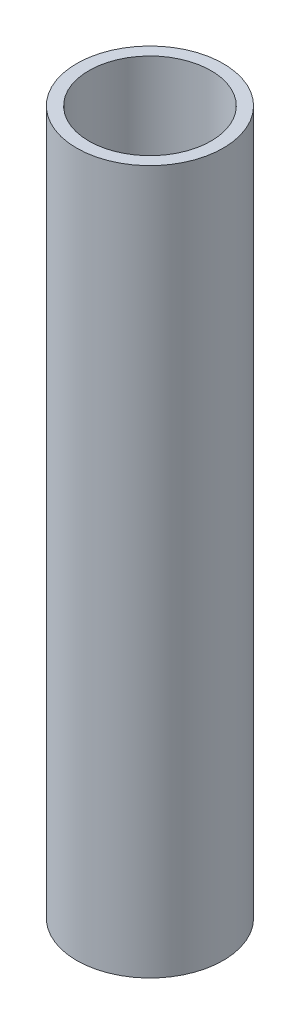
ISO-10303-21;
HEADER;
FILE_DESCRIPTION(('STEP AP214'),'2;1');
FILE_NAME('part.step','',(''),(''),'','','');
FILE_SCHEMA(('AUTOMOTIVE_DESIGN { 1 0 10303 214 1 1 1 1 }'));
ENDSEC;
DATA;
#1=APPLICATION_CONTEXT('core data for automotive mechanical design processes');
#2=APPLICATION_PROTOCOL_DEFINITION('international standard','automotive_design',2000,#1);
#3=PRODUCT_CONTEXT('',#1,'mechanical');
#4=PRODUCT('Part','Part','',(#3));
#5=PRODUCT_RELATED_PRODUCT_CATEGORY('part','',(#4));
#6=PRODUCT_DEFINITION_FORMATION('','',#4);
#7=PRODUCT_DEFINITION_CONTEXT('part definition',#1,'design');
#8=PRODUCT_DEFINITION('design','',#6,#7);
#9=PRODUCT_DEFINITION_SHAPE('','',#8);
#10=(LENGTH_UNIT() NAMED_UNIT(*) SI_UNIT(.MILLI.,.METRE.));
#11=(NAMED_UNIT(*) PLANE_ANGLE_UNIT() SI_UNIT($,.RADIAN.));
#12=(NAMED_UNIT(*) SI_UNIT($,.STERADIAN.) SOLID_ANGLE_UNIT());
#13=UNCERTAINTY_MEASURE_WITH_UNIT(LENGTH_MEASURE(1.E-05),#10,'distance_accuracy_value','');
#14=(GEOMETRIC_REPRESENTATION_CONTEXT(3) GLOBAL_UNCERTAINTY_ASSIGNED_CONTEXT((#13)) GLOBAL_UNIT_ASSIGNED_CONTEXT((#10,
#11,#12)) REPRESENTATION_CONTEXT('',''));
#15=CARTESIAN_POINT('',(0.,0.,0.));
#16=DIRECTION('',(0.,0.,1.));
#17=DIRECTION('',(1.,0.,0.));
#18=AXIS2_PLACEMENT_3D('',#15,#16,#17);
#19=CARTESIAN_POINT('',(0.,365.76,0.));
#20=DIRECTION('',(0.,-1.,0.));
#21=DIRECTION('',(0.,0.,-1.));
#22=AXIS2_PLACEMENT_3D('',#19,#20,#21);
#23=CYLINDRICAL_SURFACE('',#22,38.1);
#24=CARTESIAN_POINT('',(0.,365.76,0.));
#25=DIRECTION('',(0.,1.,0.));
#26=DIRECTION('',(0.,0.,1.));
#27=AXIS2_PLACEMENT_3D('',#24,#25,#26);
#28=CIRCLE('',#27,38.1);
#29=CARTESIAN_POINT('',(0.,365.76,38.1));
#30=VERTEX_POINT('',#29);
#31=EDGE_CURVE('E10',#30,#30,#28,.T.);
#32=ORIENTED_EDGE('',*,*,#31,.F.);
#33=EDGE_LOOP('',(#32));
#34=FACE_BOUND('',#33,.T.);
#35=CARTESIAN_POINT('',(0.,0.,0.));
#36=DIRECTION('',(0.,1.,0.));
#37=DIRECTION('',(0.,0.,1.));
#38=AXIS2_PLACEMENT_3D('',#35,#36,#37);
#39=CIRCLE('',#38,38.1);
#40=CARTESIAN_POINT('',(0.,0.,38.1));
#41=VERTEX_POINT('',#40);
#42=EDGE_CURVE('E36',#41,#41,#39,.T.);
#43=ORIENTED_EDGE('',*,*,#42,.T.);
#44=EDGE_LOOP('',(#43));
#45=FACE_BOUND('',#44,.T.);
#46=ADVANCED_FACE('F33',(#34,#45),#23,.T.);
#47=CARTESIAN_POINT('',(0.,365.76,0.));
#48=DIRECTION('',(0.,1.,0.));
#49=DIRECTION('',(0.,0.,1.));
#50=AXIS2_PLACEMENT_3D('',#47,#48,#49);
#51=PLANE('',#50);
#52=CARTESIAN_POINT('',(0.,365.76,0.));
#53=DIRECTION('',(0.,1.,0.));
#54=DIRECTION('',(0.,0.,1.));
#55=AXIS2_PLACEMENT_3D('',#52,#53,#54);
#56=CIRCLE('',#55,31.75);
#57=CARTESIAN_POINT('',(0.,365.76,31.75));
#58=VERTEX_POINT('',#57);
#59=EDGE_CURVE('E45',#58,#58,#56,.T.);
#60=ORIENTED_EDGE('',*,*,#59,.F.);
#61=EDGE_LOOP('',(#60));
#62=FACE_BOUND('',#61,.T.);
#63=ORIENTED_EDGE('',*,*,#31,.T.);
#64=EDGE_LOOP('',(#63));
#65=FACE_BOUND('',#64,.T.);
#66=ADVANCED_FACE('F60',(#62,#65),#51,.T.);
#67=CARTESIAN_POINT('',(0.,0.,0.));
#68=DIRECTION('',(0.,1.,0.));
#69=DIRECTION('',(0.,0.,1.));
#70=AXIS2_PLACEMENT_3D('',#67,#68,#69);
#71=PLANE('',#70);
#72=CARTESIAN_POINT('',(0.,0.,0.));
#73=DIRECTION('',(0.,1.,0.));
#74=DIRECTION('',(0.,0.,1.));
#75=AXIS2_PLACEMENT_3D('',#72,#73,#74);
#76=CIRCLE('',#75,31.75);
#77=CARTESIAN_POINT('',(0.,0.,31.75));
#78=VERTEX_POINT('',#77);
#79=EDGE_CURVE('E43',#78,#78,#76,.T.);
#80=ORIENTED_EDGE('',*,*,#79,.T.);
#81=EDGE_LOOP('',(#80));
#82=FACE_BOUND('',#81,.T.);
#83=ORIENTED_EDGE('',*,*,#42,.F.);
#84=EDGE_LOOP('',(#83));
#85=FACE_BOUND('',#84,.T.);
#86=ADVANCED_FACE('F51',(#82,#85),#71,.F.);
#87=CARTESIAN_POINT('',(0.,0.,0.));
#88=DIRECTION('',(0.,1.,0.));
#89=DIRECTION('',(0.,0.,1.));
#90=AXIS2_PLACEMENT_3D('',#87,#88,#89);
#91=CYLINDRICAL_SURFACE('',#90,31.75);
#92=ORIENTED_EDGE('',*,*,#79,.F.);
#93=EDGE_LOOP('',(#92));
#94=FACE_BOUND('',#93,.T.);
#95=ORIENTED_EDGE('',*,*,#59,.T.);
#96=EDGE_LOOP('',(#95));
#97=FACE_BOUND('',#96,.T.);
#98=ADVANCED_FACE('F54',(#94,#97),#91,.F.);
#99=CLOSED_SHELL('',(#46,#66,#86,#98));
#100=MANIFOLD_SOLID_BREP('B2',#99);
#101=ADVANCED_BREP_SHAPE_REPRESENTATION('',(#18,#100),#14);
#102=SHAPE_DEFINITION_REPRESENTATION(#9,#101);
ENDSEC;
END-ISO-10303-21;
